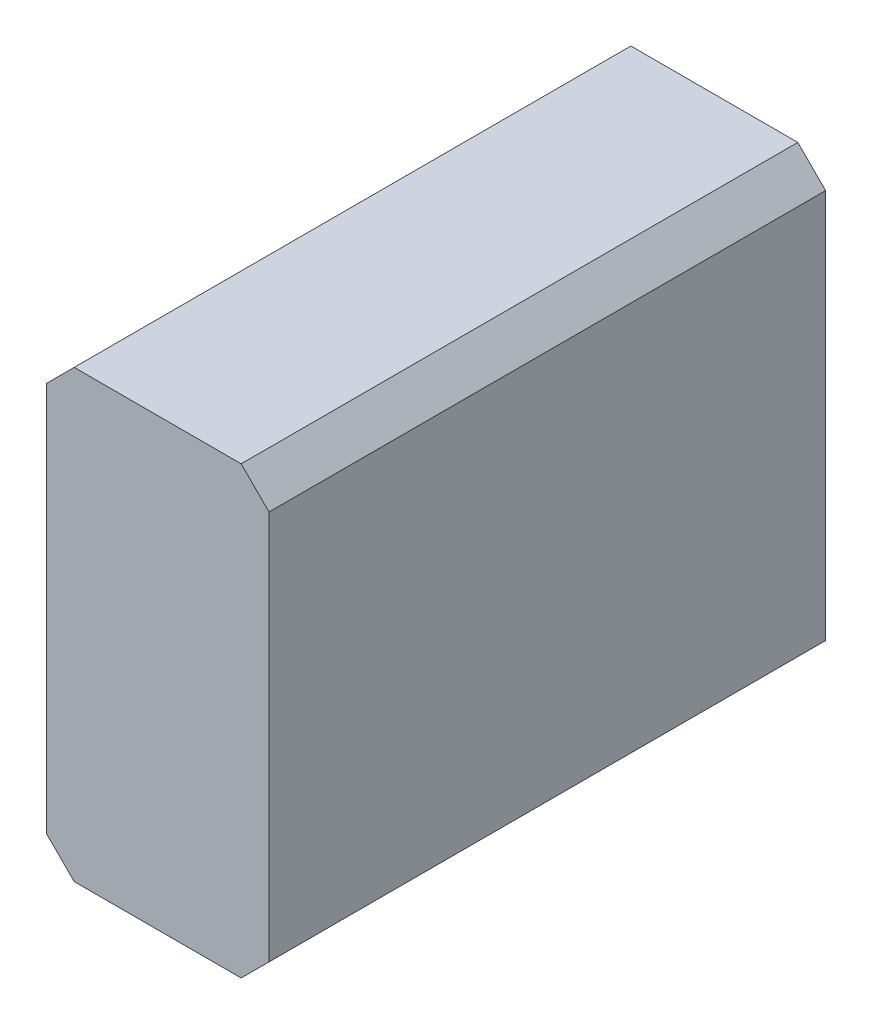
ISO-10303-21;
HEADER;
FILE_DESCRIPTION(('STEP AP214'),'2;1');
FILE_NAME('part.step','',(''),(''),'','','');
FILE_SCHEMA(('AUTOMOTIVE_DESIGN { 1 0 10303 214 1 1 1 1 }'));
ENDSEC;
DATA;
#1=APPLICATION_CONTEXT('core data for automotive mechanical design processes');
#2=APPLICATION_PROTOCOL_DEFINITION('international standard','automotive_design',2000,#1);
#3=PRODUCT_CONTEXT('',#1,'mechanical');
#4=PRODUCT('Part','Part','',(#3));
#5=PRODUCT_RELATED_PRODUCT_CATEGORY('part','',(#4));
#6=PRODUCT_DEFINITION_FORMATION('','',#4);
#7=PRODUCT_DEFINITION_CONTEXT('part definition',#1,'design');
#8=PRODUCT_DEFINITION('design','',#6,#7);
#9=PRODUCT_DEFINITION_SHAPE('','',#8);
#10=(LENGTH_UNIT() NAMED_UNIT(*) SI_UNIT(.MILLI.,.METRE.));
#11=(NAMED_UNIT(*) PLANE_ANGLE_UNIT() SI_UNIT($,.RADIAN.));
#12=(NAMED_UNIT(*) SI_UNIT($,.STERADIAN.) SOLID_ANGLE_UNIT());
#13=UNCERTAINTY_MEASURE_WITH_UNIT(LENGTH_MEASURE(1.E-05),#10,'distance_accuracy_value','');
#14=(GEOMETRIC_REPRESENTATION_CONTEXT(3) GLOBAL_UNCERTAINTY_ASSIGNED_CONTEXT((#13)) GLOBAL_UNIT_ASSIGNED_CONTEXT((#10,
#11,#12)) REPRESENTATION_CONTEXT('',''));
#15=CARTESIAN_POINT('',(0.,0.,0.));
#16=DIRECTION('',(0.,0.,1.));
#17=DIRECTION('',(1.,0.,0.));
#18=AXIS2_PLACEMENT_3D('',#15,#16,#17);
#19=CARTESIAN_POINT('',(2.,4.,10.));
#20=DIRECTION('',(-1.,0.,0.));
#21=DIRECTION('',(0.,-1.,0.));
#22=AXIS2_PLACEMENT_3D('',#19,#20,#21);
#23=PLANE('',#22);
#24=DIRECTION('',(0.,1.,0.));
#25=VECTOR('',#24,1.);
#26=CARTESIAN_POINT('',(2.,4.,10.));
#27=LINE('',#26,#25);
#28=CARTESIAN_POINT('',(2.,-3.5,10.));
#29=VERTEX_POINT('',#28);
#30=CARTESIAN_POINT('',(2.,3.5,10.));
#31=VERTEX_POINT('',#30);
#32=EDGE_CURVE('E127',#29,#31,#27,.T.);
#33=ORIENTED_EDGE('',*,*,#32,.F.);
#34=DIRECTION('',(0.,0.,-1.));
#35=VECTOR('',#34,1.);
#36=CARTESIAN_POINT('',(2.,-3.5,10.));
#37=LINE('',#36,#35);
#38=CARTESIAN_POINT('',(2.,-3.5,0.));
#39=VERTEX_POINT('',#38);
#40=EDGE_CURVE('E153',#29,#39,#37,.T.);
#41=ORIENTED_EDGE('',*,*,#40,.T.);
#42=DIRECTION('',(0.,1.,0.));
#43=VECTOR('',#42,1.);
#44=CARTESIAN_POINT('',(2.,4.,0.));
#45=LINE('',#44,#43);
#46=CARTESIAN_POINT('',(2.,3.5,0.));
#47=VERTEX_POINT('',#46);
#48=EDGE_CURVE('E159',#39,#47,#45,.T.);
#49=ORIENTED_EDGE('',*,*,#48,.T.);
#50=DIRECTION('',(0.,0.,1.));
#51=VECTOR('',#50,1.);
#52=CARTESIAN_POINT('',(2.,3.5,10.));
#53=LINE('',#52,#51);
#54=EDGE_CURVE('E151',#47,#31,#53,.T.);
#55=ORIENTED_EDGE('',*,*,#54,.T.);
#56=EDGE_LOOP('',(#33,#41,#49,#55));
#57=FACE_BOUND('',#56,.T.);
#58=ADVANCED_FACE('F34',(#57),#23,.F.);
#59=CARTESIAN_POINT('',(-2.,4.,10.));
#60=DIRECTION('',(0.,-1.,0.));
#61=DIRECTION('',(0.,0.,-1.));
#62=AXIS2_PLACEMENT_3D('',#59,#60,#61);
#63=PLANE('',#62);
#64=DIRECTION('',(-1.,0.,0.));
#65=VECTOR('',#64,1.);
#66=CARTESIAN_POINT('',(-2.,4.,10.));
#67=LINE('',#66,#65);
#68=CARTESIAN_POINT('',(1.5,4.,10.));
#69=VERTEX_POINT('',#68);
#70=CARTESIAN_POINT('',(-1.5,4.,10.));
#71=VERTEX_POINT('',#70);
#72=EDGE_CURVE('E130',#69,#71,#67,.T.);
#73=ORIENTED_EDGE('',*,*,#72,.F.);
#74=DIRECTION('',(0.,0.,-1.));
#75=VECTOR('',#74,1.);
#76=CARTESIAN_POINT('',(1.5,4.,10.));
#77=LINE('',#76,#75);
#78=CARTESIAN_POINT('',(1.5,4.,0.));
#79=VERTEX_POINT('',#78);
#80=EDGE_CURVE('E11',#69,#79,#77,.T.);
#81=ORIENTED_EDGE('',*,*,#80,.T.);
#82=DIRECTION('',(-1.,0.,0.));
#83=VECTOR('',#82,1.);
#84=CARTESIAN_POINT('',(-2.,4.,0.));
#85=LINE('',#84,#83);
#86=CARTESIAN_POINT('',(-1.5,4.,0.));
#87=VERTEX_POINT('',#86);
#88=EDGE_CURVE('E132',#79,#87,#85,.T.);
#89=ORIENTED_EDGE('',*,*,#88,.T.);
#90=DIRECTION('',(0.,0.,1.));
#91=VECTOR('',#90,1.);
#92=CARTESIAN_POINT('',(-1.5,4.,10.));
#93=LINE('',#92,#91);
#94=EDGE_CURVE('E43',#87,#71,#93,.T.);
#95=ORIENTED_EDGE('',*,*,#94,.T.);
#96=EDGE_LOOP('',(#73,#81,#89,#95));
#97=FACE_BOUND('',#96,.T.);
#98=ADVANCED_FACE('F178',(#97),#63,.F.);
#99=CARTESIAN_POINT('',(-2.,4.,10.));
#100=DIRECTION('',(1.,0.,0.));
#101=DIRECTION('',(0.,1.,0.));
#102=AXIS2_PLACEMENT_3D('',#99,#100,#101);
#103=PLANE('',#102);
#104=DIRECTION('',(0.,-1.,0.));
#105=VECTOR('',#104,1.);
#106=CARTESIAN_POINT('',(-2.,4.,0.));
#107=LINE('',#106,#105);
#108=CARTESIAN_POINT('',(-2.,3.5,0.));
#109=VERTEX_POINT('',#108);
#110=CARTESIAN_POINT('',(-2.,-3.5,0.));
#111=VERTEX_POINT('',#110);
#112=EDGE_CURVE('E128',#109,#111,#107,.T.);
#113=ORIENTED_EDGE('',*,*,#112,.T.);
#114=DIRECTION('',(0.,0.,1.));
#115=VECTOR('',#114,1.);
#116=CARTESIAN_POINT('',(-2.,-3.5,10.));
#117=LINE('',#116,#115);
#118=CARTESIAN_POINT('',(-2.,-3.5,10.));
#119=VERTEX_POINT('',#118);
#120=EDGE_CURVE('E106',#111,#119,#117,.T.);
#121=ORIENTED_EDGE('',*,*,#120,.T.);
#122=DIRECTION('',(0.,-1.,0.));
#123=VECTOR('',#122,1.);
#124=CARTESIAN_POINT('',(-2.,4.,10.));
#125=LINE('',#124,#123);
#126=CARTESIAN_POINT('',(-2.,3.5,10.));
#127=VERTEX_POINT('',#126);
#128=EDGE_CURVE('E167',#127,#119,#125,.T.);
#129=ORIENTED_EDGE('',*,*,#128,.F.);
#130=DIRECTION('',(0.,0.,-1.));
#131=VECTOR('',#130,1.);
#132=CARTESIAN_POINT('',(-2.,3.5,10.));
#133=LINE('',#132,#131);
#134=EDGE_CURVE('E111',#127,#109,#133,.T.);
#135=ORIENTED_EDGE('',*,*,#134,.T.);
#136=EDGE_LOOP('',(#113,#121,#129,#135));
#137=FACE_BOUND('',#136,.T.);
#138=ADVANCED_FACE('F177',(#137),#103,.F.);
#139=CARTESIAN_POINT('',(-2.,-4.,10.));
#140=DIRECTION('',(0.,1.,0.));
#141=DIRECTION('',(0.,0.,1.));
#142=AXIS2_PLACEMENT_3D('',#139,#140,#141);
#143=PLANE('',#142);
#144=DIRECTION('',(1.,0.,0.));
#145=VECTOR('',#144,1.);
#146=CARTESIAN_POINT('',(-2.,-4.,10.));
#147=LINE('',#146,#145);
#148=CARTESIAN_POINT('',(-1.5,-4.,10.));
#149=VERTEX_POINT('',#148);
#150=CARTESIAN_POINT('',(1.5,-4.,10.));
#151=VERTEX_POINT('',#150);
#152=EDGE_CURVE('E121',#149,#151,#147,.T.);
#153=ORIENTED_EDGE('',*,*,#152,.F.);
#154=DIRECTION('',(0.,0.,-1.));
#155=VECTOR('',#154,1.);
#156=CARTESIAN_POINT('',(-1.5,-4.,10.));
#157=LINE('',#156,#155);
#158=CARTESIAN_POINT('',(-1.5,-4.,0.));
#159=VERTEX_POINT('',#158);
#160=EDGE_CURVE('E105',#149,#159,#157,.T.);
#161=ORIENTED_EDGE('',*,*,#160,.T.);
#162=DIRECTION('',(1.,0.,0.));
#163=VECTOR('',#162,1.);
#164=CARTESIAN_POINT('',(-2.,-4.,0.));
#165=LINE('',#164,#163);
#166=CARTESIAN_POINT('',(1.5,-4.,0.));
#167=VERTEX_POINT('',#166);
#168=EDGE_CURVE('E118',#159,#167,#165,.T.);
#169=ORIENTED_EDGE('',*,*,#168,.T.);
#170=DIRECTION('',(0.,0.,1.));
#171=VECTOR('',#170,1.);
#172=CARTESIAN_POINT('',(1.5,-4.,10.));
#173=LINE('',#172,#171);
#174=EDGE_CURVE('E123',#167,#151,#173,.T.);
#175=ORIENTED_EDGE('',*,*,#174,.T.);
#176=EDGE_LOOP('',(#153,#161,#169,#175));
#177=FACE_BOUND('',#176,.T.);
#178=ADVANCED_FACE('F117',(#177),#143,.F.);
#179=CARTESIAN_POINT('',(0.,0.,10.));
#180=DIRECTION('',(0.,0.,1.));
#181=DIRECTION('',(1.,0.,0.));
#182=AXIS2_PLACEMENT_3D('',#179,#180,#181);
#183=PLANE('',#182);
#184=ORIENTED_EDGE('',*,*,#128,.T.);
#185=DIRECTION('',(-0.707106781186546,0.707106781186549,0.));
#186=VECTOR('',#185,1.);
#187=CARTESIAN_POINT('',(-2.75,-2.74999999999999,10.));
#188=LINE('',#187,#186);
#189=EDGE_CURVE('E149',#119,#149,#188,.F.);
#190=ORIENTED_EDGE('',*,*,#189,.T.);
#191=ORIENTED_EDGE('',*,*,#152,.T.);
#192=DIRECTION('',(-0.707106781186549,-0.707106781186546,0.));
#193=VECTOR('',#192,1.);
#194=CARTESIAN_POINT('',(2.75,-2.75000000000001,10.));
#195=LINE('',#194,#193);
#196=EDGE_CURVE('E147',#151,#29,#195,.F.);
#197=ORIENTED_EDGE('',*,*,#196,.T.);
#198=ORIENTED_EDGE('',*,*,#32,.T.);
#199=DIRECTION('',(0.707106781186546,-0.707106781186549,0.));
#200=VECTOR('',#199,1.);
#201=CARTESIAN_POINT('',(2.75,2.75,10.));
#202=LINE('',#201,#200);
#203=EDGE_CURVE('E56',#31,#69,#202,.F.);
#204=ORIENTED_EDGE('',*,*,#203,.T.);
#205=ORIENTED_EDGE('',*,*,#72,.T.);
#206=DIRECTION('',(0.707106781186549,0.707106781186546,0.));
#207=VECTOR('',#206,1.);
#208=CARTESIAN_POINT('',(-2.75,2.75000000000001,10.));
#209=LINE('',#208,#207);
#210=EDGE_CURVE('E144',#71,#127,#209,.F.);
#211=ORIENTED_EDGE('',*,*,#210,.T.);
#212=EDGE_LOOP('',(#184,#190,#191,#197,#198,#204,#205,#211));
#213=FACE_BOUND('',#212,.T.);
#214=ADVANCED_FACE('F171',(#213),#183,.T.);
#215=CARTESIAN_POINT('',(0.,0.,0.));
#216=DIRECTION('',(0.,0.,1.));
#217=DIRECTION('',(1.,0.,0.));
#218=AXIS2_PLACEMENT_3D('',#215,#216,#217);
#219=PLANE('',#218);
#220=ORIENTED_EDGE('',*,*,#168,.F.);
#221=DIRECTION('',(0.707106781186546,-0.707106781186549,0.));
#222=VECTOR('',#221,1.);
#223=CARTESIAN_POINT('',(-1.5,-4.,0.));
#224=LINE('',#223,#222);
#225=EDGE_CURVE('E101',#159,#111,#224,.F.);
#226=ORIENTED_EDGE('',*,*,#225,.T.);
#227=ORIENTED_EDGE('',*,*,#112,.F.);
#228=DIRECTION('',(-0.707106781186549,-0.707106781186546,0.));
#229=VECTOR('',#228,1.);
#230=CARTESIAN_POINT('',(-2.,3.5,0.));
#231=LINE('',#230,#229);
#232=EDGE_CURVE('E122',#109,#87,#231,.F.);
#233=ORIENTED_EDGE('',*,*,#232,.T.);
#234=ORIENTED_EDGE('',*,*,#88,.F.);
#235=DIRECTION('',(-0.707106781186546,0.707106781186549,0.));
#236=VECTOR('',#235,1.);
#237=CARTESIAN_POINT('',(1.5,4.,0.));
#238=LINE('',#237,#236);
#239=EDGE_CURVE('E138',#79,#47,#238,.F.);
#240=ORIENTED_EDGE('',*,*,#239,.T.);
#241=ORIENTED_EDGE('',*,*,#48,.F.);
#242=DIRECTION('',(0.707106781186549,0.707106781186546,0.));
#243=VECTOR('',#242,1.);
#244=CARTESIAN_POINT('',(2.,-3.5,0.));
#245=LINE('',#244,#243);
#246=EDGE_CURVE('E112',#39,#167,#245,.F.);
#247=ORIENTED_EDGE('',*,*,#246,.T.);
#248=EDGE_LOOP('',(#220,#226,#227,#233,#234,#240,#241,#247));
#249=FACE_BOUND('',#248,.T.);
#250=ADVANCED_FACE('F125',(#249),#219,.F.);
#251=CARTESIAN_POINT('',(-1.5,-4.,10.));
#252=DIRECTION('',(0.707106781186549,0.707106781186546,0.));
#253=DIRECTION('',(0.,0.,-1.));
#254=AXIS2_PLACEMENT_3D('',#251,#252,#253);
#255=PLANE('',#254);
#256=ORIENTED_EDGE('',*,*,#189,.F.);
#257=ORIENTED_EDGE('',*,*,#120,.F.);
#258=ORIENTED_EDGE('',*,*,#225,.F.);
#259=ORIENTED_EDGE('',*,*,#160,.F.);
#260=EDGE_LOOP('',(#256,#257,#258,#259));
#261=FACE_BOUND('',#260,.T.);
#262=ADVANCED_FACE('F104',(#261),#255,.F.);
#263=CARTESIAN_POINT('',(2.,-3.5,10.));
#264=DIRECTION('',(-0.707106781186546,0.707106781186549,0.));
#265=DIRECTION('',(0.,0.,-1.));
#266=AXIS2_PLACEMENT_3D('',#263,#264,#265);
#267=PLANE('',#266);
#268=ORIENTED_EDGE('',*,*,#196,.F.);
#269=ORIENTED_EDGE('',*,*,#174,.F.);
#270=ORIENTED_EDGE('',*,*,#246,.F.);
#271=ORIENTED_EDGE('',*,*,#40,.F.);
#272=EDGE_LOOP('',(#268,#269,#270,#271));
#273=FACE_BOUND('',#272,.T.);
#274=ADVANCED_FACE('F181',(#273),#267,.F.);
#275=CARTESIAN_POINT('',(1.5,4.,10.));
#276=DIRECTION('',(-0.707106781186549,-0.707106781186546,0.));
#277=DIRECTION('',(0.,0.,-1.));
#278=AXIS2_PLACEMENT_3D('',#275,#276,#277);
#279=PLANE('',#278);
#280=ORIENTED_EDGE('',*,*,#203,.F.);
#281=ORIENTED_EDGE('',*,*,#54,.F.);
#282=ORIENTED_EDGE('',*,*,#239,.F.);
#283=ORIENTED_EDGE('',*,*,#80,.F.);
#284=EDGE_LOOP('',(#280,#281,#282,#283));
#285=FACE_BOUND('',#284,.T.);
#286=ADVANCED_FACE('F180',(#285),#279,.F.);
#287=CARTESIAN_POINT('',(-2.,3.5,10.));
#288=DIRECTION('',(0.707106781186546,-0.707106781186549,0.));
#289=DIRECTION('',(0.,0.,-1.));
#290=AXIS2_PLACEMENT_3D('',#287,#288,#289);
#291=PLANE('',#290);
#292=ORIENTED_EDGE('',*,*,#210,.F.);
#293=ORIENTED_EDGE('',*,*,#94,.F.);
#294=ORIENTED_EDGE('',*,*,#232,.F.);
#295=ORIENTED_EDGE('',*,*,#134,.F.);
#296=EDGE_LOOP('',(#292,#293,#294,#295));
#297=FACE_BOUND('',#296,.T.);
#298=ADVANCED_FACE('F37',(#297),#291,.F.);
#299=CLOSED_SHELL('',(#58,#98,#138,#178,#214,#250,#262,#274,#286,#298));
#300=MANIFOLD_SOLID_BREP('B2',#299);
#301=ADVANCED_BREP_SHAPE_REPRESENTATION('',(#18,#300),#14);
#302=SHAPE_DEFINITION_REPRESENTATION(#9,#301);
ENDSEC;
END-ISO-10303-21;
